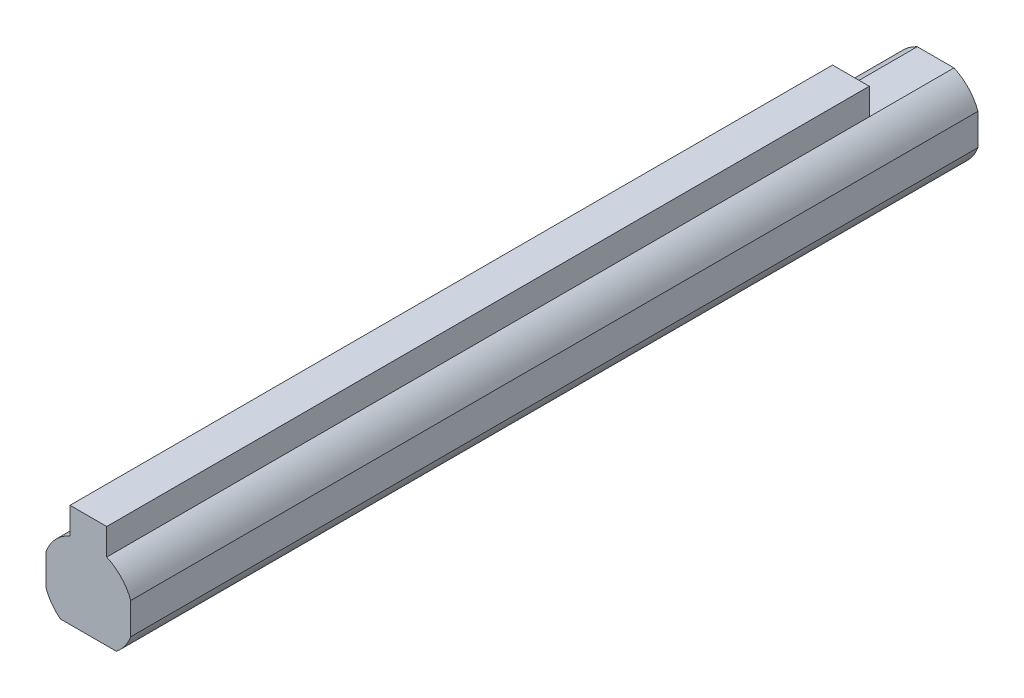
ISO-10303-21;
HEADER;
FILE_DESCRIPTION(('STEP AP214'),'2;1');
FILE_NAME('part.step','',(''),(''),'','','');
FILE_SCHEMA(('AUTOMOTIVE_DESIGN { 1 0 10303 214 1 1 1 1 }'));
ENDSEC;
DATA;
#1=APPLICATION_CONTEXT('core data for automotive mechanical design processes');
#2=APPLICATION_PROTOCOL_DEFINITION('international standard','automotive_design',2000,#1);
#3=PRODUCT_CONTEXT('',#1,'mechanical');
#4=PRODUCT('Part','Part','',(#3));
#5=PRODUCT_RELATED_PRODUCT_CATEGORY('part','',(#4));
#6=PRODUCT_DEFINITION_FORMATION('','',#4);
#7=PRODUCT_DEFINITION_CONTEXT('part definition',#1,'design');
#8=PRODUCT_DEFINITION('design','',#6,#7);
#9=PRODUCT_DEFINITION_SHAPE('','',#8);
#10=(LENGTH_UNIT() NAMED_UNIT(*) SI_UNIT(.MILLI.,.METRE.));
#11=(NAMED_UNIT(*) PLANE_ANGLE_UNIT() SI_UNIT($,.RADIAN.));
#12=(NAMED_UNIT(*) SI_UNIT($,.STERADIAN.) SOLID_ANGLE_UNIT());
#13=UNCERTAINTY_MEASURE_WITH_UNIT(LENGTH_MEASURE(1.E-05),#10,'distance_accuracy_value','');
#14=(GEOMETRIC_REPRESENTATION_CONTEXT(3) GLOBAL_UNCERTAINTY_ASSIGNED_CONTEXT((#13)) GLOBAL_UNIT_ASSIGNED_CONTEXT((#10,
#11,#12)) REPRESENTATION_CONTEXT('',''));
#15=CARTESIAN_POINT('',(0.,0.,0.));
#16=DIRECTION('',(0.,0.,1.));
#17=DIRECTION('',(1.,0.,0.));
#18=AXIS2_PLACEMENT_3D('',#15,#16,#17);
#19=CARTESIAN_POINT('',(0.,7.31009575860673,150.));
#20=DIRECTION('',(0.,1.,0.));
#21=DIRECTION('',(-1.,0.,0.));
#22=AXIS2_PLACEMENT_3D('',#19,#20,#21);
#23=PLANE('',#22);
#24=DIRECTION('',(0.,0.,-1.));
#25=VECTOR('',#24,1.);
#26=CARTESIAN_POINT('',(-3.25,7.31009575860673,150.));
#27=LINE('',#26,#25);
#28=CARTESIAN_POINT('',(-3.25,7.31009575860673,15.));
#29=VERTEX_POINT('',#28);
#30=CARTESIAN_POINT('',(-3.25,7.31009575860673,0.));
#31=VERTEX_POINT('',#30);
#32=EDGE_CURVE('E48',#29,#31,#27,.T.);
#33=ORIENTED_EDGE('',*,*,#32,.F.);
#34=DIRECTION('',(1.,0.,0.));
#35=VECTOR('',#34,1.);
#36=CARTESIAN_POINT('',(0.,7.31009575860673,15.));
#37=LINE('',#36,#35);
#38=CARTESIAN_POINT('',(3.25,7.31009575860673,15.));
#39=VERTEX_POINT('',#38);
#40=EDGE_CURVE('E233',#29,#39,#37,.T.);
#41=ORIENTED_EDGE('',*,*,#40,.T.);
#42=DIRECTION('',(0.,0.,-1.));
#43=VECTOR('',#42,1.);
#44=CARTESIAN_POINT('',(3.25,7.31009575860673,150.));
#45=LINE('',#44,#43);
#46=CARTESIAN_POINT('',(3.25,7.31009575860673,0.));
#47=VERTEX_POINT('',#46);
#48=EDGE_CURVE('E98',#39,#47,#45,.T.);
#49=ORIENTED_EDGE('',*,*,#48,.T.);
#50=DIRECTION('',(1.,0.,0.));
#51=VECTOR('',#50,1.);
#52=CARTESIAN_POINT('',(0.,7.31009575860673,0.));
#53=LINE('',#52,#51);
#54=EDGE_CURVE('E147',#31,#47,#53,.T.);
#55=ORIENTED_EDGE('',*,*,#54,.F.);
#56=EDGE_LOOP('',(#33,#41,#49,#55));
#57=FACE_BOUND('',#56,.T.);
#58=ADVANCED_FACE('F41',(#57),#23,.T.);
#59=CARTESIAN_POINT('',(0.,0.,150.));
#60=DIRECTION('',(0.,0.,-1.));
#61=DIRECTION('',(-1.,0.,0.));
#62=AXIS2_PLACEMENT_3D('',#59,#60,#61);
#63=CYLINDRICAL_SURFACE('',#62,8.);
#64=CARTESIAN_POINT('',(0.,0.,0.));
#65=DIRECTION('',(0.,0.,1.));
#66=DIRECTION('',(1.,0.,0.));
#67=AXIS2_PLACEMENT_3D('',#64,#65,#66);
#68=CIRCLE('',#67,8.);
#69=CARTESIAN_POINT('',(-7.5,2.78388218141501,0.));
#70=VERTEX_POINT('',#69);
#71=EDGE_CURVE('E150',#31,#70,#68,.T.);
#72=ORIENTED_EDGE('',*,*,#71,.T.);
#73=DIRECTION('',(0.,0.,-1.));
#74=VECTOR('',#73,1.);
#75=CARTESIAN_POINT('',(-7.5,2.78388218141501,150.));
#76=LINE('',#75,#74);
#77=CARTESIAN_POINT('',(-7.5,2.78388218141501,150.));
#78=VERTEX_POINT('',#77);
#79=EDGE_CURVE('E173',#78,#70,#76,.T.);
#80=ORIENTED_EDGE('',*,*,#79,.F.);
#81=CARTESIAN_POINT('',(0.,0.,150.));
#82=DIRECTION('',(0.,0.,1.));
#83=DIRECTION('',(1.,0.,0.));
#84=AXIS2_PLACEMENT_3D('',#81,#82,#83);
#85=CIRCLE('',#84,8.);
#86=CARTESIAN_POINT('',(-3.25,7.31009575860673,150.));
#87=VERTEX_POINT('',#86);
#88=EDGE_CURVE('E106',#87,#78,#85,.T.);
#89=ORIENTED_EDGE('',*,*,#88,.F.);
#90=EDGE_CURVE('E12',#87,#29,#27,.T.);
#91=ORIENTED_EDGE('',*,*,#90,.T.);
#92=ORIENTED_EDGE('',*,*,#32,.T.);
#93=EDGE_LOOP('',(#72,#80,#89,#91,#92));
#94=FACE_BOUND('',#93,.T.);
#95=ADVANCED_FACE('F180',(#94),#63,.T.);
#96=CARTESIAN_POINT('',(-7.5,0.,150.));
#97=DIRECTION('',(-1.,0.,0.));
#98=DIRECTION('',(0.,0.,1.));
#99=AXIS2_PLACEMENT_3D('',#96,#97,#98);
#100=PLANE('',#99);
#101=DIRECTION('',(0.,1.,0.));
#102=VECTOR('',#101,1.);
#103=CARTESIAN_POINT('',(-7.5,0.,0.));
#104=LINE('',#103,#102);
#105=CARTESIAN_POINT('',(-7.5,-2.78388218141501,0.));
#106=VERTEX_POINT('',#105);
#107=EDGE_CURVE('E154',#106,#70,#104,.T.);
#108=ORIENTED_EDGE('',*,*,#107,.F.);
#109=DIRECTION('',(0.,0.,-1.));
#110=VECTOR('',#109,1.);
#111=CARTESIAN_POINT('',(-7.5,-2.78388218141501,150.));
#112=LINE('',#111,#110);
#113=CARTESIAN_POINT('',(-7.5,-2.78388218141501,150.));
#114=VERTEX_POINT('',#113);
#115=EDGE_CURVE('E172',#114,#106,#112,.T.);
#116=ORIENTED_EDGE('',*,*,#115,.F.);
#117=DIRECTION('',(0.,1.,0.));
#118=VECTOR('',#117,1.);
#119=CARTESIAN_POINT('',(-7.5,0.,150.));
#120=LINE('',#119,#118);
#121=EDGE_CURVE('E141',#114,#78,#120,.T.);
#122=ORIENTED_EDGE('',*,*,#121,.T.);
#123=ORIENTED_EDGE('',*,*,#79,.T.);
#124=EDGE_LOOP('',(#108,#116,#122,#123));
#125=FACE_BOUND('',#124,.T.);
#126=ADVANCED_FACE('F190',(#125),#100,.T.);
#127=CARTESIAN_POINT('',(0.,0.,150.));
#128=DIRECTION('',(0.,0.,-1.));
#129=DIRECTION('',(-1.,0.,0.));
#130=AXIS2_PLACEMENT_3D('',#127,#128,#129);
#131=CYLINDRICAL_SURFACE('',#130,8.);
#132=CARTESIAN_POINT('',(0.,0.,0.));
#133=DIRECTION('',(0.,0.,1.));
#134=DIRECTION('',(1.,0.,0.));
#135=AXIS2_PLACEMENT_3D('',#132,#133,#134);
#136=CIRCLE('',#135,8.);
#137=CARTESIAN_POINT('',(-4.94962372307229,-6.285,0.));
#138=VERTEX_POINT('',#137);
#139=EDGE_CURVE('E157',#106,#138,#136,.T.);
#140=ORIENTED_EDGE('',*,*,#139,.T.);
#141=DIRECTION('',(0.,0.,-1.));
#142=VECTOR('',#141,1.);
#143=CARTESIAN_POINT('',(-4.94962372307229,-6.285,150.));
#144=LINE('',#143,#142);
#145=CARTESIAN_POINT('',(-4.94962372307229,-6.285,150.));
#146=VERTEX_POINT('',#145);
#147=EDGE_CURVE('E128',#146,#138,#144,.T.);
#148=ORIENTED_EDGE('',*,*,#147,.F.);
#149=CARTESIAN_POINT('',(0.,0.,150.));
#150=DIRECTION('',(0.,0.,1.));
#151=DIRECTION('',(1.,0.,0.));
#152=AXIS2_PLACEMENT_3D('',#149,#150,#151);
#153=CIRCLE('',#152,8.);
#154=EDGE_CURVE('E136',#114,#146,#153,.T.);
#155=ORIENTED_EDGE('',*,*,#154,.F.);
#156=ORIENTED_EDGE('',*,*,#115,.T.);
#157=EDGE_LOOP('',(#140,#148,#155,#156));
#158=FACE_BOUND('',#157,.T.);
#159=ADVANCED_FACE('F194',(#158),#131,.T.);
#160=CARTESIAN_POINT('',(0.,-6.285,150.));
#161=DIRECTION('',(0.,-1.,0.));
#162=DIRECTION('',(1.,0.,0.));
#163=AXIS2_PLACEMENT_3D('',#160,#161,#162);
#164=PLANE('',#163);
#165=DIRECTION('',(-1.,0.,0.));
#166=VECTOR('',#165,1.);
#167=CARTESIAN_POINT('',(0.,-6.285,0.));
#168=LINE('',#167,#166);
#169=CARTESIAN_POINT('',(4.94962372307229,-6.285,0.));
#170=VERTEX_POINT('',#169);
#171=EDGE_CURVE('E125',#170,#138,#168,.T.);
#172=ORIENTED_EDGE('',*,*,#171,.F.);
#173=DIRECTION('',(0.,0.,-1.));
#174=VECTOR('',#173,1.);
#175=CARTESIAN_POINT('',(4.94962372307229,-6.285,150.));
#176=LINE('',#175,#174);
#177=CARTESIAN_POINT('',(4.94962372307229,-6.285,150.));
#178=VERTEX_POINT('',#177);
#179=EDGE_CURVE('E119',#178,#170,#176,.T.);
#180=ORIENTED_EDGE('',*,*,#179,.F.);
#181=DIRECTION('',(-1.,0.,0.));
#182=VECTOR('',#181,1.);
#183=CARTESIAN_POINT('',(0.,-6.285,150.));
#184=LINE('',#183,#182);
#185=EDGE_CURVE('E123',#178,#146,#184,.T.);
#186=ORIENTED_EDGE('',*,*,#185,.T.);
#187=ORIENTED_EDGE('',*,*,#147,.T.);
#188=EDGE_LOOP('',(#172,#180,#186,#187));
#189=FACE_BOUND('',#188,.T.);
#190=ADVANCED_FACE('F121',(#189),#164,.T.);
#191=CARTESIAN_POINT('',(7.5,-2.78388218141501,0.));
#192=VERTEX_POINT('',#191);
#193=EDGE_CURVE('E160',#170,#192,#136,.T.);
#194=ORIENTED_EDGE('',*,*,#193,.T.);
#195=DIRECTION('',(0.,0.,-1.));
#196=VECTOR('',#195,1.);
#197=CARTESIAN_POINT('',(7.5,-2.78388218141501,150.));
#198=LINE('',#197,#196);
#199=CARTESIAN_POINT('',(7.5,-2.78388218141501,150.));
#200=VERTEX_POINT('',#199);
#201=EDGE_CURVE('E129',#200,#192,#198,.T.);
#202=ORIENTED_EDGE('',*,*,#201,.F.);
#203=EDGE_CURVE('E132',#178,#200,#153,.T.);
#204=ORIENTED_EDGE('',*,*,#203,.F.);
#205=ORIENTED_EDGE('',*,*,#179,.T.);
#206=EDGE_LOOP('',(#194,#202,#204,#205));
#207=FACE_BOUND('',#206,.T.);
#208=ADVANCED_FACE('F133',(#207),#131,.T.);
#209=CARTESIAN_POINT('',(7.5,0.,150.));
#210=DIRECTION('',(-1.,0.,0.));
#211=DIRECTION('',(0.,0.,1.));
#212=AXIS2_PLACEMENT_3D('',#209,#210,#211);
#213=PLANE('',#212);
#214=DIRECTION('',(0.,1.,0.));
#215=VECTOR('',#214,1.);
#216=CARTESIAN_POINT('',(7.5,0.,0.));
#217=LINE('',#216,#215);
#218=CARTESIAN_POINT('',(7.5,2.78388218141501,0.));
#219=VERTEX_POINT('',#218);
#220=EDGE_CURVE('E162',#192,#219,#217,.T.);
#221=ORIENTED_EDGE('',*,*,#220,.T.);
#222=DIRECTION('',(0.,0.,-1.));
#223=VECTOR('',#222,1.);
#224=CARTESIAN_POINT('',(7.5,2.78388218141501,150.));
#225=LINE('',#224,#223);
#226=CARTESIAN_POINT('',(7.5,2.78388218141501,150.));
#227=VERTEX_POINT('',#226);
#228=EDGE_CURVE('E167',#227,#219,#225,.T.);
#229=ORIENTED_EDGE('',*,*,#228,.F.);
#230=DIRECTION('',(0.,1.,0.));
#231=VECTOR('',#230,1.);
#232=CARTESIAN_POINT('',(7.5,0.,150.));
#233=LINE('',#232,#231);
#234=EDGE_CURVE('E64',#200,#227,#233,.T.);
#235=ORIENTED_EDGE('',*,*,#234,.F.);
#236=ORIENTED_EDGE('',*,*,#201,.T.);
#237=EDGE_LOOP('',(#221,#229,#235,#236));
#238=FACE_BOUND('',#237,.T.);
#239=ADVANCED_FACE('F201',(#238),#213,.F.);
#240=CARTESIAN_POINT('',(0.,0.,150.));
#241=DIRECTION('',(0.,0.,-1.));
#242=DIRECTION('',(-1.,0.,0.));
#243=AXIS2_PLACEMENT_3D('',#240,#241,#242);
#244=CYLINDRICAL_SURFACE('',#243,8.);
#245=CARTESIAN_POINT('',(0.,0.,0.));
#246=DIRECTION('',(0.,0.,1.));
#247=DIRECTION('',(1.,0.,0.));
#248=AXIS2_PLACEMENT_3D('',#245,#246,#247);
#249=CIRCLE('',#248,8.);
#250=EDGE_CURVE('E164',#219,#47,#249,.T.);
#251=ORIENTED_EDGE('',*,*,#250,.T.);
#252=ORIENTED_EDGE('',*,*,#48,.F.);
#253=CARTESIAN_POINT('',(3.25,7.31009575860673,150.));
#254=VERTEX_POINT('',#253);
#255=EDGE_CURVE('E55',#254,#39,#45,.T.);
#256=ORIENTED_EDGE('',*,*,#255,.F.);
#257=CARTESIAN_POINT('',(0.,0.,150.));
#258=DIRECTION('',(0.,0.,1.));
#259=DIRECTION('',(1.,0.,0.));
#260=AXIS2_PLACEMENT_3D('',#257,#258,#259);
#261=CIRCLE('',#260,8.);
#262=EDGE_CURVE('E145',#227,#254,#261,.T.);
#263=ORIENTED_EDGE('',*,*,#262,.F.);
#264=ORIENTED_EDGE('',*,*,#228,.T.);
#265=EDGE_LOOP('',(#251,#252,#256,#263,#264));
#266=FACE_BOUND('',#265,.T.);
#267=ADVANCED_FACE('F204',(#266),#244,.T.);
#268=CARTESIAN_POINT('',(0.,0.,150.));
#269=DIRECTION('',(0.,0.,1.));
#270=DIRECTION('',(1.,0.,0.));
#271=AXIS2_PLACEMENT_3D('',#268,#269,#270);
#272=PLANE('',#271);
#273=ORIENTED_EDGE('',*,*,#262,.T.);
#274=DIRECTION('',(0.,1.,0.));
#275=VECTOR('',#274,1.);
#276=CARTESIAN_POINT('',(3.25,0.,150.));
#277=LINE('',#276,#275);
#278=CARTESIAN_POINT('',(3.25,12.,150.));
#279=VERTEX_POINT('',#278);
#280=EDGE_CURVE('E248',#254,#279,#277,.T.);
#281=ORIENTED_EDGE('',*,*,#280,.T.);
#282=DIRECTION('',(-1.,0.,0.));
#283=VECTOR('',#282,1.);
#284=CARTESIAN_POINT('',(0.,12.,150.));
#285=LINE('',#284,#283);
#286=CARTESIAN_POINT('',(-3.25,12.,150.));
#287=VERTEX_POINT('',#286);
#288=EDGE_CURVE('E263',#279,#287,#285,.T.);
#289=ORIENTED_EDGE('',*,*,#288,.T.);
#290=DIRECTION('',(0.,1.,0.));
#291=VECTOR('',#290,1.);
#292=CARTESIAN_POINT('',(-3.25,0.,150.));
#293=LINE('',#292,#291);
#294=EDGE_CURVE('E261',#87,#287,#293,.T.);
#295=ORIENTED_EDGE('',*,*,#294,.F.);
#296=ORIENTED_EDGE('',*,*,#88,.T.);
#297=ORIENTED_EDGE('',*,*,#121,.F.);
#298=ORIENTED_EDGE('',*,*,#154,.T.);
#299=ORIENTED_EDGE('',*,*,#185,.F.);
#300=ORIENTED_EDGE('',*,*,#203,.T.);
#301=ORIENTED_EDGE('',*,*,#234,.T.);
#302=EDGE_LOOP('',(#273,#281,#289,#295,#296,#297,#298,#299,#300,#301));
#303=FACE_BOUND('',#302,.T.);
#304=ADVANCED_FACE('F137',(#303),#272,.T.);
#305=CARTESIAN_POINT('',(0.,0.,0.));
#306=DIRECTION('',(0.,0.,1.));
#307=DIRECTION('',(1.,0.,0.));
#308=AXIS2_PLACEMENT_3D('',#305,#306,#307);
#309=PLANE('',#308);
#310=ORIENTED_EDGE('',*,*,#54,.T.);
#311=ORIENTED_EDGE('',*,*,#250,.F.);
#312=ORIENTED_EDGE('',*,*,#220,.F.);
#313=ORIENTED_EDGE('',*,*,#193,.F.);
#314=ORIENTED_EDGE('',*,*,#171,.T.);
#315=ORIENTED_EDGE('',*,*,#139,.F.);
#316=ORIENTED_EDGE('',*,*,#107,.T.);
#317=ORIENTED_EDGE('',*,*,#71,.F.);
#318=EDGE_LOOP('',(#310,#311,#312,#313,#314,#315,#316,#317));
#319=FACE_BOUND('',#318,.T.);
#320=ADVANCED_FACE('F183',(#319),#309,.F.);
#321=CARTESIAN_POINT('',(3.25,0.,-8.01531046145057));
#322=DIRECTION('',(1.,0.,0.));
#323=DIRECTION('',(0.,1.,0.));
#324=AXIS2_PLACEMENT_3D('',#321,#322,#323);
#325=PLANE('',#324);
#326=DIRECTION('',(0.,-1.,0.));
#327=VECTOR('',#326,1.);
#328=CARTESIAN_POINT('',(3.25,0.,15.));
#329=LINE('',#328,#327);
#330=CARTESIAN_POINT('',(3.25,12.,15.));
#331=VERTEX_POINT('',#330);
#332=EDGE_CURVE('E231',#331,#39,#329,.T.);
#333=ORIENTED_EDGE('',*,*,#332,.F.);
#334=DIRECTION('',(0.,0.,1.));
#335=VECTOR('',#334,1.);
#336=CARTESIAN_POINT('',(3.25,12.,-8.01531046145057));
#337=LINE('',#336,#335);
#338=EDGE_CURVE('E258',#331,#279,#337,.T.);
#339=ORIENTED_EDGE('',*,*,#338,.T.);
#340=ORIENTED_EDGE('',*,*,#280,.F.);
#341=ORIENTED_EDGE('',*,*,#255,.T.);
#342=EDGE_LOOP('',(#333,#339,#340,#341));
#343=FACE_BOUND('',#342,.T.);
#344=ADVANCED_FACE('F211',(#343),#325,.T.);
#345=CARTESIAN_POINT('',(-3.25,0.,-8.01531046145057));
#346=DIRECTION('',(1.,0.,0.));
#347=DIRECTION('',(0.,1.,0.));
#348=AXIS2_PLACEMENT_3D('',#345,#346,#347);
#349=PLANE('',#348);
#350=DIRECTION('',(0.,0.,1.));
#351=VECTOR('',#350,1.);
#352=CARTESIAN_POINT('',(-3.25,12.,-8.01531046145057));
#353=LINE('',#352,#351);
#354=CARTESIAN_POINT('',(-3.25,12.,15.));
#355=VERTEX_POINT('',#354);
#356=EDGE_CURVE('E260',#355,#287,#353,.T.);
#357=ORIENTED_EDGE('',*,*,#356,.F.);
#358=DIRECTION('',(0.,-1.,0.));
#359=VECTOR('',#358,1.);
#360=CARTESIAN_POINT('',(-3.25,0.,15.));
#361=LINE('',#360,#359);
#362=EDGE_CURVE('E240',#355,#29,#361,.T.);
#363=ORIENTED_EDGE('',*,*,#362,.T.);
#364=ORIENTED_EDGE('',*,*,#90,.F.);
#365=ORIENTED_EDGE('',*,*,#294,.T.);
#366=EDGE_LOOP('',(#357,#363,#364,#365));
#367=FACE_BOUND('',#366,.T.);
#368=ADVANCED_FACE('F216',(#367),#349,.F.);
#369=CARTESIAN_POINT('',(0.,12.,-8.01531046145057));
#370=DIRECTION('',(0.,1.,0.));
#371=DIRECTION('',(-1.,0.,0.));
#372=AXIS2_PLACEMENT_3D('',#369,#370,#371);
#373=PLANE('',#372);
#374=DIRECTION('',(1.,0.,0.));
#375=VECTOR('',#374,1.);
#376=CARTESIAN_POINT('',(0.,12.,15.));
#377=LINE('',#376,#375);
#378=EDGE_CURVE('E151',#355,#331,#377,.T.);
#379=ORIENTED_EDGE('',*,*,#378,.F.);
#380=ORIENTED_EDGE('',*,*,#356,.T.);
#381=ORIENTED_EDGE('',*,*,#288,.F.);
#382=ORIENTED_EDGE('',*,*,#338,.F.);
#383=EDGE_LOOP('',(#379,#380,#381,#382));
#384=FACE_BOUND('',#383,.T.);
#385=ADVANCED_FACE('F217',(#384),#373,.T.);
#386=CARTESIAN_POINT('',(0.,0.,15.));
#387=DIRECTION('',(0.,0.,1.));
#388=DIRECTION('',(1.,0.,0.));
#389=AXIS2_PLACEMENT_3D('',#386,#387,#388);
#390=PLANE('',#389);
#391=ORIENTED_EDGE('',*,*,#332,.T.);
#392=ORIENTED_EDGE('',*,*,#40,.F.);
#393=ORIENTED_EDGE('',*,*,#362,.F.);
#394=ORIENTED_EDGE('',*,*,#378,.T.);
#395=EDGE_LOOP('',(#391,#392,#393,#394));
#396=FACE_BOUND('',#395,.T.);
#397=ADVANCED_FACE('F220',(#396),#390,.F.);
#398=CLOSED_SHELL('',(#58,#95,#126,#159,#190,#208,#239,#267,#304,#320,#344,#368,#385,#397));
#399=MANIFOLD_SOLID_BREP('B2',#398);
#400=ADVANCED_BREP_SHAPE_REPRESENTATION('',(#18,#399),#14);
#401=SHAPE_DEFINITION_REPRESENTATION(#9,#400);
ENDSEC;
END-ISO-10303-21;
